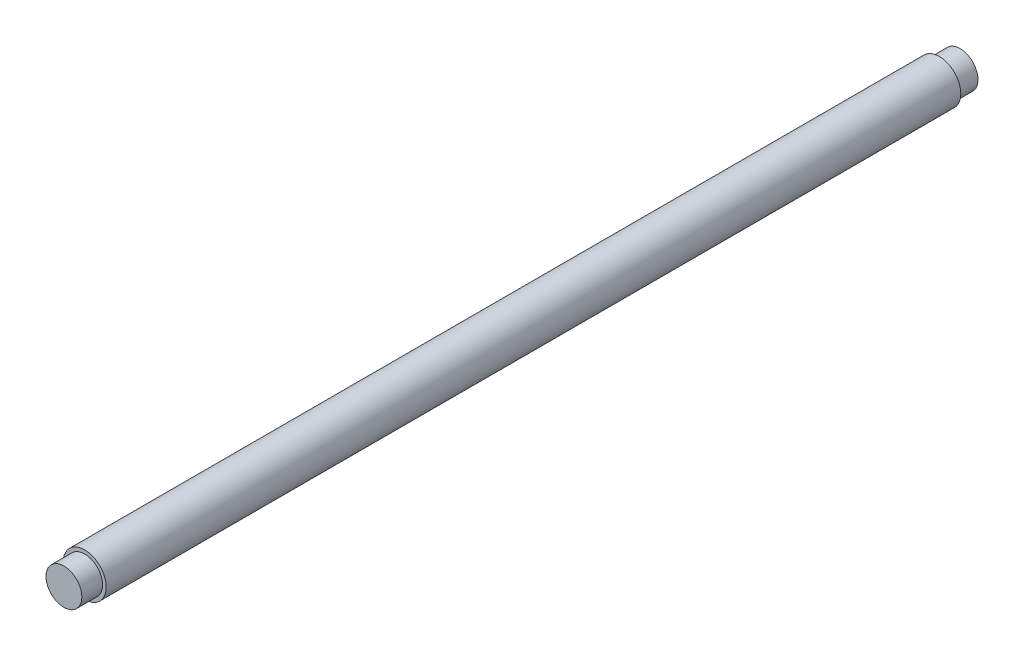
ISO-10303-21;
HEADER;
FILE_DESCRIPTION(('STEP AP214'),'2;1');
FILE_NAME('part.step','',(''),(''),'','','');
FILE_SCHEMA(('AUTOMOTIVE_DESIGN { 1 0 10303 214 1 1 1 1 }'));
ENDSEC;
DATA;
#1=APPLICATION_CONTEXT('core data for automotive mechanical design processes');
#2=APPLICATION_PROTOCOL_DEFINITION('international standard','automotive_design',2000,#1);
#3=PRODUCT_CONTEXT('',#1,'mechanical');
#4=PRODUCT('Part','Part','',(#3));
#5=PRODUCT_RELATED_PRODUCT_CATEGORY('part','',(#4));
#6=PRODUCT_DEFINITION_FORMATION('','',#4);
#7=PRODUCT_DEFINITION_CONTEXT('part definition',#1,'design');
#8=PRODUCT_DEFINITION('design','',#6,#7);
#9=PRODUCT_DEFINITION_SHAPE('','',#8);
#10=(LENGTH_UNIT() NAMED_UNIT(*) SI_UNIT(.MILLI.,.METRE.));
#11=(NAMED_UNIT(*) PLANE_ANGLE_UNIT() SI_UNIT($,.RADIAN.));
#12=(NAMED_UNIT(*) SI_UNIT($,.STERADIAN.) SOLID_ANGLE_UNIT());
#13=UNCERTAINTY_MEASURE_WITH_UNIT(LENGTH_MEASURE(1.E-05),#10,'distance_accuracy_value','');
#14=(GEOMETRIC_REPRESENTATION_CONTEXT(3) GLOBAL_UNCERTAINTY_ASSIGNED_CONTEXT((#13)) GLOBAL_UNIT_ASSIGNED_CONTEXT((#10,
#11,#12)) REPRESENTATION_CONTEXT('',''));
#15=CARTESIAN_POINT('',(0.,0.,0.));
#16=DIRECTION('',(0.,0.,1.));
#17=DIRECTION('',(1.,0.,0.));
#18=AXIS2_PLACEMENT_3D('',#15,#16,#17);
#19=CARTESIAN_POINT('',(0.,0.,250.));
#20=DIRECTION('',(0.,0.,-1.));
#21=DIRECTION('',(-1.,0.,0.));
#22=AXIS2_PLACEMENT_3D('',#19,#20,#21);
#23=CYLINDRICAL_SURFACE('',#22,6.);
#24=CARTESIAN_POINT('',(0.,0.,244.2));
#25=DIRECTION('',(0.,0.,1.));
#26=DIRECTION('',(1.,0.,0.));
#27=AXIS2_PLACEMENT_3D('',#24,#25,#26);
#28=CIRCLE('',#27,6.);
#29=CARTESIAN_POINT('',(6.,0.,244.2));
#30=VERTEX_POINT('',#29);
#31=EDGE_CURVE('E10',#30,#30,#28,.T.);
#32=ORIENTED_EDGE('',*,*,#31,.F.);
#33=EDGE_LOOP('',(#32));
#34=FACE_BOUND('',#33,.T.);
#35=CARTESIAN_POINT('',(0.,0.,5.8));
#36=DIRECTION('',(0.,0.,1.));
#37=DIRECTION('',(1.,0.,0.));
#38=AXIS2_PLACEMENT_3D('',#35,#36,#37);
#39=CIRCLE('',#38,6.);
#40=CARTESIAN_POINT('',(6.,0.,5.8));
#41=VERTEX_POINT('',#40);
#42=EDGE_CURVE('E55',#41,#41,#39,.T.);
#43=ORIENTED_EDGE('',*,*,#42,.T.);
#44=EDGE_LOOP('',(#43));
#45=FACE_BOUND('',#44,.T.);
#46=ADVANCED_FACE('F37',(#34,#45),#23,.T.);
#47=CARTESIAN_POINT('',(0.,0.,244.2));
#48=DIRECTION('',(0.,0.,1.));
#49=DIRECTION('',(1.,0.,0.));
#50=AXIS2_PLACEMENT_3D('',#47,#48,#49);
#51=PLANE('',#50);
#52=CARTESIAN_POINT('',(0.,0.,244.2));
#53=DIRECTION('',(0.,0.,1.));
#54=DIRECTION('',(1.,0.,0.));
#55=AXIS2_PLACEMENT_3D('',#52,#53,#54);
#56=CIRCLE('',#55,5.);
#57=CARTESIAN_POINT('',(5.,0.,244.2));
#58=VERTEX_POINT('',#57);
#59=EDGE_CURVE('E44',#58,#58,#56,.T.);
#60=ORIENTED_EDGE('',*,*,#59,.F.);
#61=EDGE_LOOP('',(#60));
#62=FACE_BOUND('',#61,.T.);
#63=ORIENTED_EDGE('',*,*,#31,.T.);
#64=EDGE_LOOP('',(#63));
#65=FACE_BOUND('',#64,.T.);
#66=ADVANCED_FACE('F83',(#62,#65),#51,.T.);
#67=CARTESIAN_POINT('',(0.,0.,244.2));
#68=DIRECTION('',(0.,0.,1.));
#69=DIRECTION('',(1.,0.,0.));
#70=AXIS2_PLACEMENT_3D('',#67,#68,#69);
#71=CYLINDRICAL_SURFACE('',#70,5.);
#72=ORIENTED_EDGE('',*,*,#59,.T.);
#73=EDGE_LOOP('',(#72));
#74=FACE_BOUND('',#73,.T.);
#75=CARTESIAN_POINT('',(0.,0.,250.));
#76=DIRECTION('',(0.,0.,1.));
#77=DIRECTION('',(1.,0.,0.));
#78=AXIS2_PLACEMENT_3D('',#75,#76,#77);
#79=CIRCLE('',#78,5.);
#80=CARTESIAN_POINT('',(5.,0.,250.));
#81=VERTEX_POINT('',#80);
#82=EDGE_CURVE('E49',#81,#81,#79,.T.);
#83=ORIENTED_EDGE('',*,*,#82,.F.);
#84=EDGE_LOOP('',(#83));
#85=FACE_BOUND('',#84,.T.);
#86=ADVANCED_FACE('F88',(#74,#85),#71,.T.);
#87=CARTESIAN_POINT('',(0.,0.,250.));
#88=DIRECTION('',(0.,0.,1.));
#89=DIRECTION('',(1.,0.,0.));
#90=AXIS2_PLACEMENT_3D('',#87,#88,#89);
#91=PLANE('',#90);
#92=ORIENTED_EDGE('',*,*,#82,.T.);
#93=EDGE_LOOP('',(#92));
#94=FACE_BOUND('',#93,.T.);
#95=ADVANCED_FACE('F95',(#94),#91,.T.);
#96=CARTESIAN_POINT('',(0.,0.,5.8));
#97=DIRECTION('',(0.,0.,-1.));
#98=DIRECTION('',(1.,0.,0.));
#99=AXIS2_PLACEMENT_3D('',#96,#97,#98);
#100=PLANE('',#99);
#101=ORIENTED_EDGE('',*,*,#42,.F.);
#102=EDGE_LOOP('',(#101));
#103=FACE_BOUND('',#102,.T.);
#104=CARTESIAN_POINT('',(0.,0.,5.8));
#105=DIRECTION('',(0.,0.,1.));
#106=DIRECTION('',(1.,0.,0.));
#107=AXIS2_PLACEMENT_3D('',#104,#105,#106);
#108=CIRCLE('',#107,5.);
#109=CARTESIAN_POINT('',(5.,0.,5.8));
#110=VERTEX_POINT('',#109);
#111=EDGE_CURVE('E60',#110,#110,#108,.T.);
#112=ORIENTED_EDGE('',*,*,#111,.T.);
#113=EDGE_LOOP('',(#112));
#114=FACE_BOUND('',#113,.T.);
#115=ADVANCED_FACE('F69',(#103,#114),#100,.T.);
#116=CARTESIAN_POINT('',(0.,0.,5.8));
#117=DIRECTION('',(0.,0.,-1.));
#118=DIRECTION('',(-1.,0.,0.));
#119=AXIS2_PLACEMENT_3D('',#116,#117,#118);
#120=CYLINDRICAL_SURFACE('',#119,5.);
#121=ORIENTED_EDGE('',*,*,#111,.F.);
#122=EDGE_LOOP('',(#121));
#123=FACE_BOUND('',#122,.T.);
#124=CARTESIAN_POINT('',(0.,0.,0.));
#125=DIRECTION('',(0.,0.,1.));
#126=DIRECTION('',(1.,0.,0.));
#127=AXIS2_PLACEMENT_3D('',#124,#125,#126);
#128=CIRCLE('',#127,5.);
#129=CARTESIAN_POINT('',(5.,0.,0.));
#130=VERTEX_POINT('',#129);
#131=EDGE_CURVE('E61',#130,#130,#128,.T.);
#132=ORIENTED_EDGE('',*,*,#131,.T.);
#133=EDGE_LOOP('',(#132));
#134=FACE_BOUND('',#133,.T.);
#135=ADVANCED_FACE('F71',(#123,#134),#120,.T.);
#136=CARTESIAN_POINT('',(0.,0.,0.));
#137=DIRECTION('',(0.,0.,1.));
#138=DIRECTION('',(1.,0.,0.));
#139=AXIS2_PLACEMENT_3D('',#136,#137,#138);
#140=PLANE('',#139);
#141=ORIENTED_EDGE('',*,*,#131,.F.);
#142=EDGE_LOOP('',(#141));
#143=FACE_BOUND('',#142,.T.);
#144=ADVANCED_FACE('F74',(#143),#140,.F.);
#145=CLOSED_SHELL('',(#46,#66,#86,#95,#115,#135,#144));
#146=MANIFOLD_SOLID_BREP('B2',#145);
#147=ADVANCED_BREP_SHAPE_REPRESENTATION('',(#18,#146),#14);
#148=SHAPE_DEFINITION_REPRESENTATION(#9,#147);
ENDSEC;
END-ISO-10303-21;
